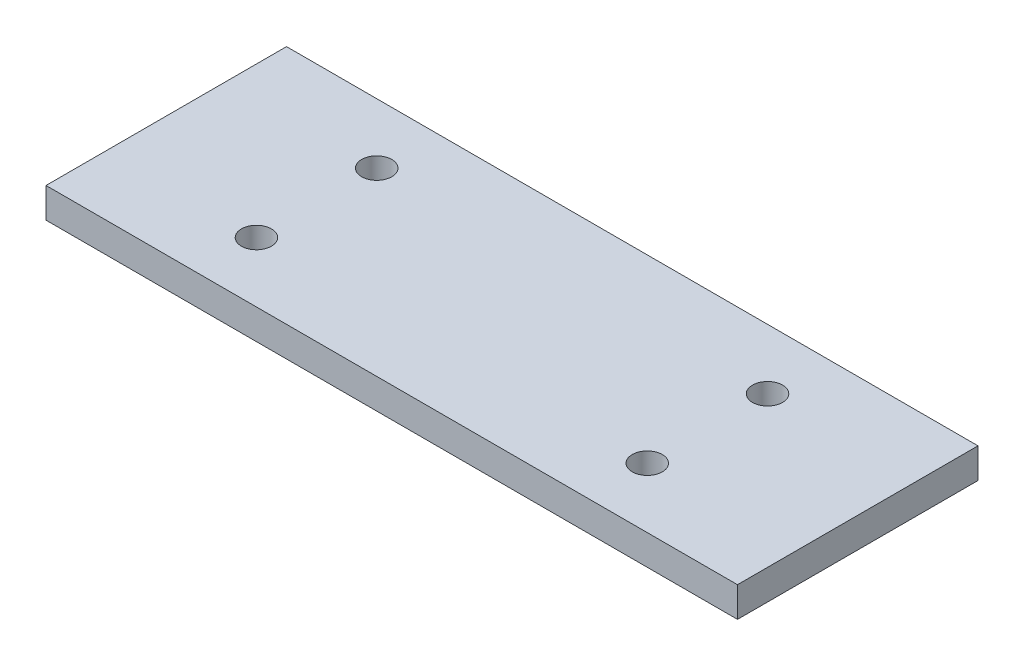
ISO-10303-21;
HEADER;
FILE_DESCRIPTION(('STEP AP214'),'2;1');
FILE_NAME('part.step','',(''),(''),'','','');
FILE_SCHEMA(('AUTOMOTIVE_DESIGN { 1 0 10303 214 1 1 1 1 }'));
ENDSEC;
DATA;
#1=APPLICATION_CONTEXT('core data for automotive mechanical design processes');
#2=APPLICATION_PROTOCOL_DEFINITION('international standard','automotive_design',2000,#1);
#3=PRODUCT_CONTEXT('',#1,'mechanical');
#4=PRODUCT('Part','Part','',(#3));
#5=PRODUCT_RELATED_PRODUCT_CATEGORY('part','',(#4));
#6=PRODUCT_DEFINITION_FORMATION('','',#4);
#7=PRODUCT_DEFINITION_CONTEXT('part definition',#1,'design');
#8=PRODUCT_DEFINITION('design','',#6,#7);
#9=PRODUCT_DEFINITION_SHAPE('','',#8);
#10=(LENGTH_UNIT() NAMED_UNIT(*) SI_UNIT(.MILLI.,.METRE.));
#11=(NAMED_UNIT(*) PLANE_ANGLE_UNIT() SI_UNIT($,.RADIAN.));
#12=(NAMED_UNIT(*) SI_UNIT($,.STERADIAN.) SOLID_ANGLE_UNIT());
#13=UNCERTAINTY_MEASURE_WITH_UNIT(LENGTH_MEASURE(1.E-05),#10,'distance_accuracy_value','');
#14=(GEOMETRIC_REPRESENTATION_CONTEXT(3) GLOBAL_UNCERTAINTY_ASSIGNED_CONTEXT((#13)) GLOBAL_UNIT_ASSIGNED_CONTEXT((#10,
#11,#12)) REPRESENTATION_CONTEXT('',''));
#15=CARTESIAN_POINT('',(0.,0.,0.));
#16=DIRECTION('',(0.,0.,1.));
#17=DIRECTION('',(1.,0.,0.));
#18=AXIS2_PLACEMENT_3D('',#15,#16,#17);
#19=CARTESIAN_POINT('',(57.5,2.5,-20.));
#20=DIRECTION('',(-1.,0.,0.));
#21=DIRECTION('',(0.,0.,1.));
#22=AXIS2_PLACEMENT_3D('',#19,#20,#21);
#23=PLANE('',#22);
#24=DIRECTION('',(0.,0.,-1.));
#25=VECTOR('',#24,1.);
#26=CARTESIAN_POINT('',(57.5,-2.5,-20.));
#27=LINE('',#26,#25);
#28=CARTESIAN_POINT('',(57.5,-2.5,20.));
#29=VERTEX_POINT('',#28);
#30=CARTESIAN_POINT('',(57.5,-2.5,-20.));
#31=VERTEX_POINT('',#30);
#32=EDGE_CURVE('E113',#29,#31,#27,.T.);
#33=ORIENTED_EDGE('',*,*,#32,.T.);
#34=DIRECTION('',(0.,-1.,0.));
#35=VECTOR('',#34,1.);
#36=CARTESIAN_POINT('',(57.5,2.5,-20.));
#37=LINE('',#36,#35);
#38=CARTESIAN_POINT('',(57.5,2.5,-20.));
#39=VERTEX_POINT('',#38);
#40=EDGE_CURVE('E11',#39,#31,#37,.T.);
#41=ORIENTED_EDGE('',*,*,#40,.F.);
#42=DIRECTION('',(0.,0.,-1.));
#43=VECTOR('',#42,1.);
#44=CARTESIAN_POINT('',(57.5,2.5,-20.));
#45=LINE('',#44,#43);
#46=CARTESIAN_POINT('',(57.5,2.5,20.));
#47=VERTEX_POINT('',#46);
#48=EDGE_CURVE('E97',#47,#39,#45,.T.);
#49=ORIENTED_EDGE('',*,*,#48,.F.);
#50=DIRECTION('',(0.,-1.,0.));
#51=VECTOR('',#50,1.);
#52=CARTESIAN_POINT('',(57.5,2.5,20.));
#53=LINE('',#52,#51);
#54=EDGE_CURVE('E109',#47,#29,#53,.T.);
#55=ORIENTED_EDGE('',*,*,#54,.T.);
#56=EDGE_LOOP('',(#33,#41,#49,#55));
#57=FACE_BOUND('',#56,.T.);
#58=ADVANCED_FACE('F45',(#57),#23,.F.);
#59=CARTESIAN_POINT('',(-57.5,2.5,-20.));
#60=DIRECTION('',(0.,0.,1.));
#61=DIRECTION('',(1.,0.,0.));
#62=AXIS2_PLACEMENT_3D('',#59,#60,#61);
#63=PLANE('',#62);
#64=DIRECTION('',(-1.,0.,0.));
#65=VECTOR('',#64,1.);
#66=CARTESIAN_POINT('',(-57.5,-2.5,-20.));
#67=LINE('',#66,#65);
#68=CARTESIAN_POINT('',(-57.5,-2.5,-20.));
#69=VERTEX_POINT('',#68);
#70=EDGE_CURVE('E102',#31,#69,#67,.T.);
#71=ORIENTED_EDGE('',*,*,#70,.T.);
#72=DIRECTION('',(0.,-1.,0.));
#73=VECTOR('',#72,1.);
#74=CARTESIAN_POINT('',(-57.5,2.5,-20.));
#75=LINE('',#74,#73);
#76=CARTESIAN_POINT('',(-57.5,2.5,-20.));
#77=VERTEX_POINT('',#76);
#78=EDGE_CURVE('E54',#77,#69,#75,.T.);
#79=ORIENTED_EDGE('',*,*,#78,.F.);
#80=DIRECTION('',(-1.,0.,0.));
#81=VECTOR('',#80,1.);
#82=CARTESIAN_POINT('',(-57.5,2.5,-20.));
#83=LINE('',#82,#81);
#84=EDGE_CURVE('E92',#39,#77,#83,.T.);
#85=ORIENTED_EDGE('',*,*,#84,.F.);
#86=ORIENTED_EDGE('',*,*,#40,.T.);
#87=EDGE_LOOP('',(#71,#79,#85,#86));
#88=FACE_BOUND('',#87,.T.);
#89=ADVANCED_FACE('F101',(#88),#63,.F.);
#90=CARTESIAN_POINT('',(-57.5,2.5,-20.));
#91=DIRECTION('',(1.,0.,0.));
#92=DIRECTION('',(0.,0.,-1.));
#93=AXIS2_PLACEMENT_3D('',#90,#91,#92);
#94=PLANE('',#93);
#95=DIRECTION('',(0.,0.,1.));
#96=VECTOR('',#95,1.);
#97=CARTESIAN_POINT('',(-57.5,-2.5,-20.));
#98=LINE('',#97,#96);
#99=CARTESIAN_POINT('',(-57.5,-2.5,20.));
#100=VERTEX_POINT('',#99);
#101=EDGE_CURVE('E79',#69,#100,#98,.T.);
#102=ORIENTED_EDGE('',*,*,#101,.T.);
#103=DIRECTION('',(0.,-1.,0.));
#104=VECTOR('',#103,1.);
#105=CARTESIAN_POINT('',(-57.5,2.5,20.));
#106=LINE('',#105,#104);
#107=CARTESIAN_POINT('',(-57.5,2.5,20.));
#108=VERTEX_POINT('',#107);
#109=EDGE_CURVE('E104',#108,#100,#106,.T.);
#110=ORIENTED_EDGE('',*,*,#109,.F.);
#111=DIRECTION('',(0.,0.,1.));
#112=VECTOR('',#111,1.);
#113=CARTESIAN_POINT('',(-57.5,2.5,-20.));
#114=LINE('',#113,#112);
#115=EDGE_CURVE('E95',#77,#108,#114,.T.);
#116=ORIENTED_EDGE('',*,*,#115,.F.);
#117=ORIENTED_EDGE('',*,*,#78,.T.);
#118=EDGE_LOOP('',(#102,#110,#116,#117));
#119=FACE_BOUND('',#118,.T.);
#120=ADVANCED_FACE('F105',(#119),#94,.F.);
#121=CARTESIAN_POINT('',(-57.5,2.5,20.));
#122=DIRECTION('',(0.,0.,-1.));
#123=DIRECTION('',(-1.,0.,0.));
#124=AXIS2_PLACEMENT_3D('',#121,#122,#123);
#125=PLANE('',#124);
#126=DIRECTION('',(1.,0.,0.));
#127=VECTOR('',#126,1.);
#128=CARTESIAN_POINT('',(-57.5,-2.5,20.));
#129=LINE('',#128,#127);
#130=EDGE_CURVE('E85',#100,#29,#129,.T.);
#131=ORIENTED_EDGE('',*,*,#130,.T.);
#132=ORIENTED_EDGE('',*,*,#54,.F.);
#133=DIRECTION('',(1.,0.,0.));
#134=VECTOR('',#133,1.);
#135=CARTESIAN_POINT('',(-57.5,2.5,20.));
#136=LINE('',#135,#134);
#137=EDGE_CURVE('E62',#108,#47,#136,.T.);
#138=ORIENTED_EDGE('',*,*,#137,.F.);
#139=ORIENTED_EDGE('',*,*,#109,.T.);
#140=EDGE_LOOP('',(#131,#132,#138,#139));
#141=FACE_BOUND('',#140,.T.);
#142=ADVANCED_FACE('F127',(#141),#125,.F.);
#143=CARTESIAN_POINT('',(0.,2.5,0.));
#144=DIRECTION('',(0.,1.,0.));
#145=DIRECTION('',(0.,0.,1.));
#146=AXIS2_PLACEMENT_3D('',#143,#144,#145);
#147=PLANE('',#146);
#148=CARTESIAN_POINT('',(-32.5,2.5,-10.));
#149=DIRECTION('',(0.,1.,0.));
#150=DIRECTION('',(0.,0.,1.));
#151=AXIS2_PLACEMENT_3D('',#148,#149,#150);
#152=CIRCLE('',#151,2.50000000000001);
#153=CARTESIAN_POINT('',(-32.5,2.5,-7.49999999999999));
#154=VERTEX_POINT('',#153);
#155=EDGE_CURVE('E161',#154,#154,#152,.T.);
#156=ORIENTED_EDGE('',*,*,#155,.F.);
#157=EDGE_LOOP('',(#156));
#158=FACE_BOUND('',#157,.T.);
#159=CARTESIAN_POINT('',(-32.5,2.5,10.));
#160=DIRECTION('',(0.,1.,0.));
#161=DIRECTION('',(0.,0.,1.));
#162=AXIS2_PLACEMENT_3D('',#159,#160,#161);
#163=CIRCLE('',#162,2.50000000000001);
#164=CARTESIAN_POINT('',(-32.5,2.5,12.5));
#165=VERTEX_POINT('',#164);
#166=EDGE_CURVE('E153',#165,#165,#163,.T.);
#167=ORIENTED_EDGE('',*,*,#166,.F.);
#168=EDGE_LOOP('',(#167));
#169=FACE_BOUND('',#168,.T.);
#170=CARTESIAN_POINT('',(32.5,2.5,-10.));
#171=DIRECTION('',(0.,1.,0.));
#172=DIRECTION('',(0.,0.,1.));
#173=AXIS2_PLACEMENT_3D('',#170,#171,#172);
#174=CIRCLE('',#173,2.50000000000002);
#175=CARTESIAN_POINT('',(32.5,2.5,-7.49999999999998));
#176=VERTEX_POINT('',#175);
#177=EDGE_CURVE('E145',#176,#176,#174,.T.);
#178=ORIENTED_EDGE('',*,*,#177,.F.);
#179=EDGE_LOOP('',(#178));
#180=FACE_BOUND('',#179,.T.);
#181=CARTESIAN_POINT('',(32.5,2.5,10.));
#182=DIRECTION('',(0.,1.,0.));
#183=DIRECTION('',(0.,0.,1.));
#184=AXIS2_PLACEMENT_3D('',#181,#182,#183);
#185=CIRCLE('',#184,2.50000000000002);
#186=CARTESIAN_POINT('',(32.5,2.5,12.5));
#187=VERTEX_POINT('',#186);
#188=EDGE_CURVE('E137',#187,#187,#185,.T.);
#189=ORIENTED_EDGE('',*,*,#188,.F.);
#190=EDGE_LOOP('',(#189));
#191=FACE_BOUND('',#190,.T.);
#192=ORIENTED_EDGE('',*,*,#48,.T.);
#193=ORIENTED_EDGE('',*,*,#84,.T.);
#194=ORIENTED_EDGE('',*,*,#115,.T.);
#195=ORIENTED_EDGE('',*,*,#137,.T.);
#196=EDGE_LOOP('',(#192,#193,#194,#195));
#197=FACE_BOUND('',#196,.T.);
#198=ADVANCED_FACE('F93',(#158,#169,#180,#191,#197),#147,.T.);
#199=CARTESIAN_POINT('',(0.,-2.5,0.));
#200=DIRECTION('',(0.,1.,0.));
#201=DIRECTION('',(0.,0.,1.));
#202=AXIS2_PLACEMENT_3D('',#199,#200,#201);
#203=PLANE('',#202);
#204=CARTESIAN_POINT('',(-32.5,-2.5,-10.));
#205=DIRECTION('',(0.,1.,0.));
#206=DIRECTION('',(0.,0.,1.));
#207=AXIS2_PLACEMENT_3D('',#204,#205,#206);
#208=CIRCLE('',#207,2.50000000000001);
#209=CARTESIAN_POINT('',(-32.5,-2.5,-7.49999999999999));
#210=VERTEX_POINT('',#209);
#211=EDGE_CURVE('E157',#210,#210,#208,.T.);
#212=ORIENTED_EDGE('',*,*,#211,.T.);
#213=EDGE_LOOP('',(#212));
#214=FACE_BOUND('',#213,.T.);
#215=CARTESIAN_POINT('',(-32.5,-2.5,10.));
#216=DIRECTION('',(0.,1.,0.));
#217=DIRECTION('',(0.,0.,1.));
#218=AXIS2_PLACEMENT_3D('',#215,#216,#217);
#219=CIRCLE('',#218,2.50000000000001);
#220=CARTESIAN_POINT('',(-32.5,-2.5,12.5));
#221=VERTEX_POINT('',#220);
#222=EDGE_CURVE('E149',#221,#221,#219,.T.);
#223=ORIENTED_EDGE('',*,*,#222,.T.);
#224=EDGE_LOOP('',(#223));
#225=FACE_BOUND('',#224,.T.);
#226=CARTESIAN_POINT('',(32.5,-2.5,-10.));
#227=DIRECTION('',(0.,1.,0.));
#228=DIRECTION('',(0.,0.,1.));
#229=AXIS2_PLACEMENT_3D('',#226,#227,#228);
#230=CIRCLE('',#229,2.50000000000002);
#231=CARTESIAN_POINT('',(32.5,-2.5,-7.49999999999998));
#232=VERTEX_POINT('',#231);
#233=EDGE_CURVE('E141',#232,#232,#230,.T.);
#234=ORIENTED_EDGE('',*,*,#233,.T.);
#235=EDGE_LOOP('',(#234));
#236=FACE_BOUND('',#235,.T.);
#237=CARTESIAN_POINT('',(32.5,-2.5,10.));
#238=DIRECTION('',(0.,1.,0.));
#239=DIRECTION('',(0.,0.,1.));
#240=AXIS2_PLACEMENT_3D('',#237,#238,#239);
#241=CIRCLE('',#240,2.50000000000002);
#242=CARTESIAN_POINT('',(32.5,-2.5,12.5));
#243=VERTEX_POINT('',#242);
#244=EDGE_CURVE('E117',#243,#243,#241,.T.);
#245=ORIENTED_EDGE('',*,*,#244,.T.);
#246=EDGE_LOOP('',(#245));
#247=FACE_BOUND('',#246,.T.);
#248=ORIENTED_EDGE('',*,*,#32,.F.);
#249=ORIENTED_EDGE('',*,*,#130,.F.);
#250=ORIENTED_EDGE('',*,*,#101,.F.);
#251=ORIENTED_EDGE('',*,*,#70,.F.);
#252=EDGE_LOOP('',(#248,#249,#250,#251));
#253=FACE_BOUND('',#252,.T.);
#254=ADVANCED_FACE('F130',(#214,#225,#236,#247,#253),#203,.F.);
#255=CARTESIAN_POINT('',(32.5,2.5,10.));
#256=DIRECTION('',(0.,1.,0.));
#257=DIRECTION('',(0.,0.,1.));
#258=AXIS2_PLACEMENT_3D('',#255,#256,#257);
#259=CYLINDRICAL_SURFACE('',#258,2.50000000000002);
#260=ORIENTED_EDGE('',*,*,#244,.F.);
#261=EDGE_LOOP('',(#260));
#262=FACE_BOUND('',#261,.T.);
#263=ORIENTED_EDGE('',*,*,#188,.T.);
#264=EDGE_LOOP('',(#263));
#265=FACE_BOUND('',#264,.T.);
#266=ADVANCED_FACE('F177',(#262,#265),#259,.F.);
#267=CARTESIAN_POINT('',(32.5,2.5,-10.));
#268=DIRECTION('',(0.,1.,0.));
#269=DIRECTION('',(0.,0.,1.));
#270=AXIS2_PLACEMENT_3D('',#267,#268,#269);
#271=CYLINDRICAL_SURFACE('',#270,2.50000000000002);
#272=ORIENTED_EDGE('',*,*,#233,.F.);
#273=EDGE_LOOP('',(#272));
#274=FACE_BOUND('',#273,.T.);
#275=ORIENTED_EDGE('',*,*,#177,.T.);
#276=EDGE_LOOP('',(#275));
#277=FACE_BOUND('',#276,.T.);
#278=ADVANCED_FACE('F179',(#274,#277),#271,.F.);
#279=CARTESIAN_POINT('',(-32.5,2.5,10.));
#280=DIRECTION('',(0.,1.,0.));
#281=DIRECTION('',(0.,0.,1.));
#282=AXIS2_PLACEMENT_3D('',#279,#280,#281);
#283=CYLINDRICAL_SURFACE('',#282,2.50000000000001);
#284=ORIENTED_EDGE('',*,*,#222,.F.);
#285=EDGE_LOOP('',(#284));
#286=FACE_BOUND('',#285,.T.);
#287=ORIENTED_EDGE('',*,*,#166,.T.);
#288=EDGE_LOOP('',(#287));
#289=FACE_BOUND('',#288,.T.);
#290=ADVANCED_FACE('F186',(#286,#289),#283,.F.);
#291=CARTESIAN_POINT('',(-32.5,2.5,-10.));
#292=DIRECTION('',(0.,1.,0.));
#293=DIRECTION('',(0.,0.,1.));
#294=AXIS2_PLACEMENT_3D('',#291,#292,#293);
#295=CYLINDRICAL_SURFACE('',#294,2.50000000000001);
#296=ORIENTED_EDGE('',*,*,#211,.F.);
#297=EDGE_LOOP('',(#296));
#298=FACE_BOUND('',#297,.T.);
#299=ORIENTED_EDGE('',*,*,#155,.T.);
#300=EDGE_LOOP('',(#299));
#301=FACE_BOUND('',#300,.T.);
#302=ADVANCED_FACE('F166',(#298,#301),#295,.F.);
#303=CLOSED_SHELL('',(#58,#89,#120,#142,#198,#254,#266,#278,#290,#302));
#304=MANIFOLD_SOLID_BREP('B2',#303);
#305=ADVANCED_BREP_SHAPE_REPRESENTATION('',(#18,#304),#14);
#306=SHAPE_DEFINITION_REPRESENTATION(#9,#305);
ENDSEC;
END-ISO-10303-21;
